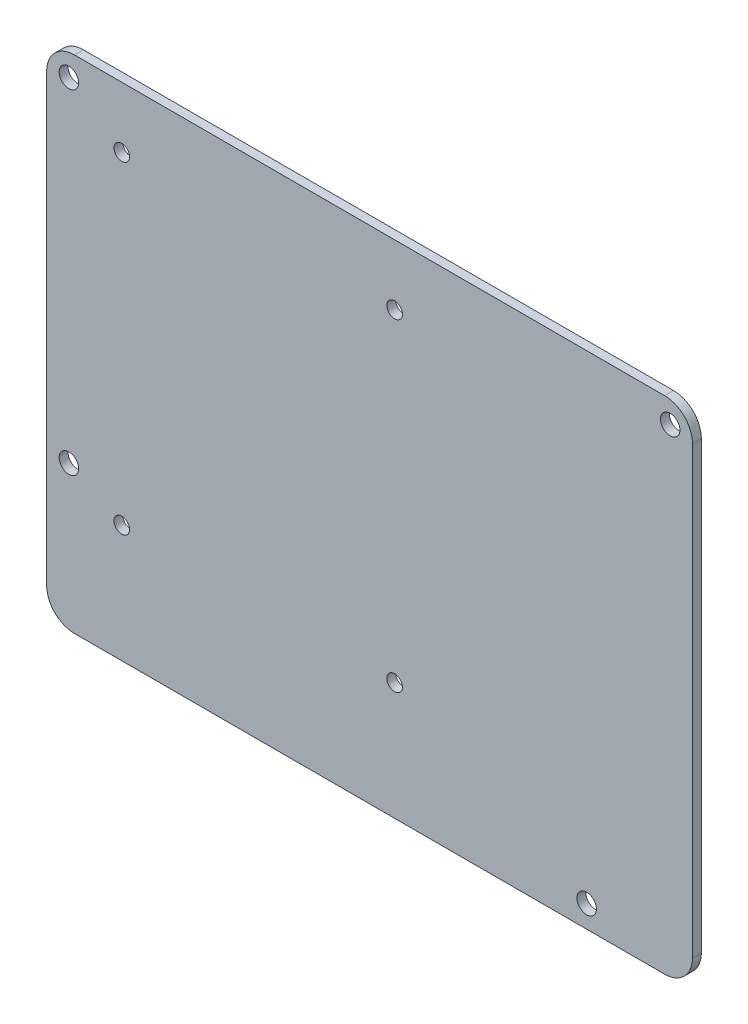
ISO-10303-21;
HEADER;
FILE_DESCRIPTION(('STEP AP214'),'2;1');
FILE_NAME('part.step','',(''),(''),'','','');
FILE_SCHEMA(('AUTOMOTIVE_DESIGN { 1 0 10303 214 1 1 1 1 }'));
ENDSEC;
DATA;
#1=APPLICATION_CONTEXT('core data for automotive mechanical design processes');
#2=APPLICATION_PROTOCOL_DEFINITION('international standard','automotive_design',2000,#1);
#3=PRODUCT_CONTEXT('',#1,'mechanical');
#4=PRODUCT('Part','Part','',(#3));
#5=PRODUCT_RELATED_PRODUCT_CATEGORY('part','',(#4));
#6=PRODUCT_DEFINITION_FORMATION('','',#4);
#7=PRODUCT_DEFINITION_CONTEXT('part definition',#1,'design');
#8=PRODUCT_DEFINITION('design','',#6,#7);
#9=PRODUCT_DEFINITION_SHAPE('','',#8);
#10=(LENGTH_UNIT() NAMED_UNIT(*) SI_UNIT(.MILLI.,.METRE.));
#11=(NAMED_UNIT(*) PLANE_ANGLE_UNIT() SI_UNIT($,.RADIAN.));
#12=(NAMED_UNIT(*) SI_UNIT($,.STERADIAN.) SOLID_ANGLE_UNIT());
#13=UNCERTAINTY_MEASURE_WITH_UNIT(LENGTH_MEASURE(1.E-05),#10,'distance_accuracy_value','');
#14=(GEOMETRIC_REPRESENTATION_CONTEXT(3) GLOBAL_UNCERTAINTY_ASSIGNED_CONTEXT((#13)) GLOBAL_UNIT_ASSIGNED_CONTEXT((#10,
#11,#12)) REPRESENTATION_CONTEXT('',''));
#15=CARTESIAN_POINT('',(0.,0.,0.));
#16=DIRECTION('',(0.,0.,1.));
#17=DIRECTION('',(1.,0.,0.));
#18=AXIS2_PLACEMENT_3D('',#15,#16,#17);
#19=CARTESIAN_POINT('',(-97.0000000000001,86.,1.6));
#20=DIRECTION('',(1.,0.,0.));
#21=DIRECTION('',(0.,1.,0.));
#22=AXIS2_PLACEMENT_3D('',#19,#20,#21);
#23=PLANE('',#22);
#24=DIRECTION('',(0.,-1.,0.));
#25=VECTOR('',#24,1.);
#26=CARTESIAN_POINT('',(-97.0000000000001,86.,1.6));
#27=LINE('',#26,#25);
#28=CARTESIAN_POINT('',(-97.0000000000001,81.,1.6));
#29=VERTEX_POINT('',#28);
#30=CARTESIAN_POINT('',(-97.0000000000001,1.00000000000003,1.6));
#31=VERTEX_POINT('',#30);
#32=EDGE_CURVE('E127',#29,#31,#27,.T.);
#33=ORIENTED_EDGE('',*,*,#32,.F.);
#34=DIRECTION('',(0.,0.,-1.));
#35=VECTOR('',#34,1.);
#36=CARTESIAN_POINT('',(-97.0000000000001,81.,1.6));
#37=LINE('',#36,#35);
#38=CARTESIAN_POINT('',(-97.0000000000001,81.,0.));
#39=VERTEX_POINT('',#38);
#40=EDGE_CURVE('E153',#29,#39,#37,.T.);
#41=ORIENTED_EDGE('',*,*,#40,.T.);
#42=DIRECTION('',(0.,-1.,0.));
#43=VECTOR('',#42,1.);
#44=CARTESIAN_POINT('',(-97.0000000000001,86.,0.));
#45=LINE('',#44,#43);
#46=CARTESIAN_POINT('',(-97.0000000000001,1.00000000000003,0.));
#47=VERTEX_POINT('',#46);
#48=EDGE_CURVE('E159',#39,#47,#45,.T.);
#49=ORIENTED_EDGE('',*,*,#48,.T.);
#50=DIRECTION('',(0.,0.,-1.));
#51=VECTOR('',#50,1.);
#52=CARTESIAN_POINT('',(-97.0000000000001,1.,1.6));
#53=LINE('',#52,#51);
#54=EDGE_CURVE('E151',#47,#31,#53,.F.);
#55=ORIENTED_EDGE('',*,*,#54,.T.);
#56=EDGE_LOOP('',(#33,#41,#49,#55));
#57=FACE_BOUND('',#56,.T.);
#58=ADVANCED_FACE('F35',(#57),#23,.F.);
#59=CARTESIAN_POINT('',(18.9999999999999,-3.99999999999999,1.6));
#60=DIRECTION('',(0.,1.,0.));
#61=DIRECTION('',(-1.,0.,0.));
#62=AXIS2_PLACEMENT_3D('',#59,#60,#61);
#63=PLANE('',#62);
#64=DIRECTION('',(1.,0.,0.));
#65=VECTOR('',#64,1.);
#66=CARTESIAN_POINT('',(18.9999999999999,-3.99999999999999,1.6));
#67=LINE('',#66,#65);
#68=CARTESIAN_POINT('',(-92.,-4.,1.6));
#69=VERTEX_POINT('',#68);
#70=CARTESIAN_POINT('',(13.9999999999999,-3.99999999999999,1.6));
#71=VERTEX_POINT('',#70);
#72=EDGE_CURVE('E130',#69,#71,#67,.T.);
#73=ORIENTED_EDGE('',*,*,#72,.F.);
#74=DIRECTION('',(0.,0.,-1.));
#75=VECTOR('',#74,1.);
#76=CARTESIAN_POINT('',(-92.0000000000001,-4.,1.6));
#77=LINE('',#76,#75);
#78=CARTESIAN_POINT('',(-92.,-4.,0.));
#79=VERTEX_POINT('',#78);
#80=EDGE_CURVE('E11',#69,#79,#77,.T.);
#81=ORIENTED_EDGE('',*,*,#80,.T.);
#82=DIRECTION('',(1.,0.,0.));
#83=VECTOR('',#82,1.);
#84=CARTESIAN_POINT('',(18.9999999999999,-3.99999999999999,0.));
#85=LINE('',#84,#83);
#86=CARTESIAN_POINT('',(13.9999999999999,-3.99999999999999,0.));
#87=VERTEX_POINT('',#86);
#88=EDGE_CURVE('E132',#79,#87,#85,.T.);
#89=ORIENTED_EDGE('',*,*,#88,.T.);
#90=DIRECTION('',(0.,0.,-1.));
#91=VECTOR('',#90,1.);
#92=CARTESIAN_POINT('',(13.9999999999999,-3.99999999999999,1.6));
#93=LINE('',#92,#91);
#94=EDGE_CURVE('E43',#87,#71,#93,.F.);
#95=ORIENTED_EDGE('',*,*,#94,.T.);
#96=EDGE_LOOP('',(#73,#81,#89,#95));
#97=FACE_BOUND('',#96,.T.);
#98=ADVANCED_FACE('F256',(#97),#63,.F.);
#99=CARTESIAN_POINT('',(18.9999999999999,86.,1.6));
#100=DIRECTION('',(-1.,0.,0.));
#101=DIRECTION('',(0.,-1.,0.));
#102=AXIS2_PLACEMENT_3D('',#99,#100,#101);
#103=PLANE('',#102);
#104=DIRECTION('',(0.,1.,0.));
#105=VECTOR('',#104,1.);
#106=CARTESIAN_POINT('',(18.9999999999999,86.,0.));
#107=LINE('',#106,#105);
#108=CARTESIAN_POINT('',(18.9999999999999,1.00000000000006,0.));
#109=VERTEX_POINT('',#108);
#110=CARTESIAN_POINT('',(18.9999999999999,81.,0.));
#111=VERTEX_POINT('',#110);
#112=EDGE_CURVE('E128',#109,#111,#107,.T.);
#113=ORIENTED_EDGE('',*,*,#112,.T.);
#114=DIRECTION('',(0.,0.,-1.));
#115=VECTOR('',#114,1.);
#116=CARTESIAN_POINT('',(18.9999999999999,81.,1.6));
#117=LINE('',#116,#115);
#118=CARTESIAN_POINT('',(18.9999999999999,81.,1.6));
#119=VERTEX_POINT('',#118);
#120=EDGE_CURVE('E106',#111,#119,#117,.F.);
#121=ORIENTED_EDGE('',*,*,#120,.T.);
#122=DIRECTION('',(0.,1.,0.));
#123=VECTOR('',#122,1.);
#124=CARTESIAN_POINT('',(18.9999999999999,86.,1.6));
#125=LINE('',#124,#123);
#126=CARTESIAN_POINT('',(18.9999999999999,1.00000000000006,1.6));
#127=VERTEX_POINT('',#126);
#128=EDGE_CURVE('E171',#127,#119,#125,.T.);
#129=ORIENTED_EDGE('',*,*,#128,.F.);
#130=DIRECTION('',(0.,0.,-1.));
#131=VECTOR('',#130,1.);
#132=CARTESIAN_POINT('',(18.9999999999999,1.00000000000003,1.6));
#133=LINE('',#132,#131);
#134=EDGE_CURVE('E111',#127,#109,#133,.T.);
#135=ORIENTED_EDGE('',*,*,#134,.T.);
#136=EDGE_LOOP('',(#113,#121,#129,#135));
#137=FACE_BOUND('',#136,.T.);
#138=ADVANCED_FACE('F254',(#137),#103,.F.);
#139=CARTESIAN_POINT('',(18.9999999999999,86.,1.6));
#140=DIRECTION('',(0.,-1.,0.));
#141=DIRECTION('',(1.,0.,0.));
#142=AXIS2_PLACEMENT_3D('',#139,#140,#141);
#143=PLANE('',#142);
#144=DIRECTION('',(-1.,0.,0.));
#145=VECTOR('',#144,1.);
#146=CARTESIAN_POINT('',(18.9999999999999,86.,1.6));
#147=LINE('',#146,#145);
#148=CARTESIAN_POINT('',(13.9999999999999,86.,1.6));
#149=VERTEX_POINT('',#148);
#150=CARTESIAN_POINT('',(-92.0000000000001,86.,1.6));
#151=VERTEX_POINT('',#150);
#152=EDGE_CURVE('E121',#149,#151,#147,.T.);
#153=ORIENTED_EDGE('',*,*,#152,.F.);
#154=DIRECTION('',(0.,0.,-1.));
#155=VECTOR('',#154,1.);
#156=CARTESIAN_POINT('',(13.9999999999999,86.,1.6));
#157=LINE('',#156,#155);
#158=CARTESIAN_POINT('',(13.9999999999999,86.,0.));
#159=VERTEX_POINT('',#158);
#160=EDGE_CURVE('E105',#149,#159,#157,.T.);
#161=ORIENTED_EDGE('',*,*,#160,.T.);
#162=DIRECTION('',(-1.,0.,0.));
#163=VECTOR('',#162,1.);
#164=CARTESIAN_POINT('',(18.9999999999999,86.,0.));
#165=LINE('',#164,#163);
#166=CARTESIAN_POINT('',(-92.0000000000001,86.,0.));
#167=VERTEX_POINT('',#166);
#168=EDGE_CURVE('E118',#159,#167,#165,.T.);
#169=ORIENTED_EDGE('',*,*,#168,.T.);
#170=DIRECTION('',(0.,0.,-1.));
#171=VECTOR('',#170,1.);
#172=CARTESIAN_POINT('',(-92.0000000000001,86.,1.6));
#173=LINE('',#172,#171);
#174=EDGE_CURVE('E123',#167,#151,#173,.F.);
#175=ORIENTED_EDGE('',*,*,#174,.T.);
#176=EDGE_LOOP('',(#153,#161,#169,#175));
#177=FACE_BOUND('',#176,.T.);
#178=ADVANCED_FACE('F117',(#177),#143,.F.);
#179=CARTESIAN_POINT('',(0.,0.,1.6));
#180=DIRECTION('',(0.,0.,-1.));
#181=DIRECTION('',(-1.,0.,0.));
#182=AXIS2_PLACEMENT_3D('',#179,#180,#181);
#183=PLANE('',#182);
#184=CARTESIAN_POINT('',(-34.5,75.1,1.6));
#185=DIRECTION('',(0.,0.,-1.));
#186=DIRECTION('',(-1.,0.,0.));
#187=AXIS2_PLACEMENT_3D('',#184,#185,#186);
#188=CIRCLE('',#187,1.4);
#189=CARTESIAN_POINT('',(-35.9,75.1,1.6));
#190=VERTEX_POINT('',#189);
#191=EDGE_CURVE('E213',#190,#190,#188,.T.);
#192=ORIENTED_EDGE('',*,*,#191,.T.);
#193=EDGE_LOOP('',(#192));
#194=FACE_BOUND('',#193,.T.);
#195=CARTESIAN_POINT('',(-83.5,75.1,1.6));
#196=DIRECTION('',(0.,0.,-1.));
#197=DIRECTION('',(-1.,0.,0.));
#198=AXIS2_PLACEMENT_3D('',#195,#196,#197);
#199=CIRCLE('',#198,1.4);
#200=CARTESIAN_POINT('',(-84.9,75.1,1.6));
#201=VERTEX_POINT('',#200);
#202=EDGE_CURVE('E207',#201,#201,#199,.T.);
#203=ORIENTED_EDGE('',*,*,#202,.T.);
#204=EDGE_LOOP('',(#203));
#205=FACE_BOUND('',#204,.T.);
#206=CARTESIAN_POINT('',(-83.5,17.1,1.6));
#207=DIRECTION('',(0.,0.,-1.));
#208=DIRECTION('',(-1.,0.,0.));
#209=AXIS2_PLACEMENT_3D('',#206,#207,#208);
#210=CIRCLE('',#209,1.4);
#211=CARTESIAN_POINT('',(-84.9,17.1,1.6));
#212=VERTEX_POINT('',#211);
#213=EDGE_CURVE('E201',#212,#212,#210,.T.);
#214=ORIENTED_EDGE('',*,*,#213,.T.);
#215=EDGE_LOOP('',(#214));
#216=FACE_BOUND('',#215,.T.);
#217=CARTESIAN_POINT('',(-34.5,17.1,1.6));
#218=DIRECTION('',(0.,0.,-1.));
#219=DIRECTION('',(-1.,0.,0.));
#220=AXIS2_PLACEMENT_3D('',#217,#218,#219);
#221=CIRCLE('',#220,1.4);
#222=CARTESIAN_POINT('',(-35.9,17.1,1.6));
#223=VERTEX_POINT('',#222);
#224=EDGE_CURVE('E195',#223,#223,#221,.T.);
#225=ORIENTED_EDGE('',*,*,#224,.T.);
#226=EDGE_LOOP('',(#225));
#227=FACE_BOUND('',#226,.T.);
#228=CARTESIAN_POINT('',(0.,0.,1.6));
#229=DIRECTION('',(0.,0.,1.));
#230=DIRECTION('',(1.,0.,0.));
#231=AXIS2_PLACEMENT_3D('',#228,#229,#230);
#232=CIRCLE('',#231,1.75);
#233=CARTESIAN_POINT('',(1.75,0.,1.6));
#234=VERTEX_POINT('',#233);
#235=EDGE_CURVE('E192',#234,#234,#232,.T.);
#236=ORIENTED_EDGE('',*,*,#235,.F.);
#237=EDGE_LOOP('',(#236));
#238=FACE_BOUND('',#237,.T.);
#239=CARTESIAN_POINT('',(15.,82.,1.6));
#240=DIRECTION('',(0.,0.,1.));
#241=DIRECTION('',(1.,0.,0.));
#242=AXIS2_PLACEMENT_3D('',#239,#240,#241);
#243=CIRCLE('',#242,1.74999999999999);
#244=CARTESIAN_POINT('',(16.75,82.,1.6));
#245=VERTEX_POINT('',#244);
#246=EDGE_CURVE('E186',#245,#245,#243,.T.);
#247=ORIENTED_EDGE('',*,*,#246,.F.);
#248=EDGE_LOOP('',(#247));
#249=FACE_BOUND('',#248,.T.);
#250=CARTESIAN_POINT('',(-93.,82.,1.6));
#251=DIRECTION('',(0.,0.,1.));
#252=DIRECTION('',(1.,0.,0.));
#253=AXIS2_PLACEMENT_3D('',#250,#251,#252);
#254=CIRCLE('',#253,1.75);
#255=CARTESIAN_POINT('',(-91.25,82.,1.6));
#256=VERTEX_POINT('',#255);
#257=EDGE_CURVE('E180',#256,#256,#254,.T.);
#258=ORIENTED_EDGE('',*,*,#257,.F.);
#259=EDGE_LOOP('',(#258));
#260=FACE_BOUND('',#259,.T.);
#261=CARTESIAN_POINT('',(-93.,22.,1.6));
#262=DIRECTION('',(0.,0.,1.));
#263=DIRECTION('',(1.,0.,0.));
#264=AXIS2_PLACEMENT_3D('',#261,#262,#263);
#265=CIRCLE('',#264,1.75);
#266=CARTESIAN_POINT('',(-91.25,22.,1.6));
#267=VERTEX_POINT('',#266);
#268=EDGE_CURVE('E167',#267,#267,#265,.T.);
#269=ORIENTED_EDGE('',*,*,#268,.F.);
#270=EDGE_LOOP('',(#269));
#271=FACE_BOUND('',#270,.T.);
#272=ORIENTED_EDGE('',*,*,#128,.T.);
#273=CARTESIAN_POINT('',(13.9999999999999,81.,1.6));
#274=DIRECTION('',(0.,0.,-1.));
#275=DIRECTION('',(-1.,0.,0.));
#276=AXIS2_PLACEMENT_3D('',#273,#274,#275);
#277=CIRCLE('',#276,5.);
#278=EDGE_CURVE('E149',#119,#149,#277,.F.);
#279=ORIENTED_EDGE('',*,*,#278,.T.);
#280=ORIENTED_EDGE('',*,*,#152,.T.);
#281=CARTESIAN_POINT('',(-92.0000000000001,81.,1.6));
#282=DIRECTION('',(0.,0.,-1.));
#283=DIRECTION('',(-1.,0.,0.));
#284=AXIS2_PLACEMENT_3D('',#281,#282,#283);
#285=CIRCLE('',#284,5.);
#286=EDGE_CURVE('E147',#151,#29,#285,.F.);
#287=ORIENTED_EDGE('',*,*,#286,.T.);
#288=ORIENTED_EDGE('',*,*,#32,.T.);
#289=CARTESIAN_POINT('',(-92.0000000000001,1.,1.6));
#290=DIRECTION('',(0.,0.,-1.));
#291=DIRECTION('',(-1.,0.,0.));
#292=AXIS2_PLACEMENT_3D('',#289,#290,#291);
#293=CIRCLE('',#292,5.);
#294=EDGE_CURVE('E56',#31,#69,#293,.F.);
#295=ORIENTED_EDGE('',*,*,#294,.T.);
#296=ORIENTED_EDGE('',*,*,#72,.T.);
#297=CARTESIAN_POINT('',(13.9999999999999,1.00000000000003,1.6));
#298=DIRECTION('',(0.,0.,-1.));
#299=DIRECTION('',(-1.,0.,0.));
#300=AXIS2_PLACEMENT_3D('',#297,#298,#299);
#301=CIRCLE('',#300,5.);
#302=EDGE_CURVE('E144',#71,#127,#301,.F.);
#303=ORIENTED_EDGE('',*,*,#302,.T.);
#304=EDGE_LOOP('',(#272,#279,#280,#287,#288,#295,#296,#303));
#305=FACE_BOUND('',#304,.T.);
#306=ADVANCED_FACE('F225',(#194,#205,#216,#227,#238,#249,#260,#271,#305),#183,.F.);
#307=CARTESIAN_POINT('',(0.,0.,0.));
#308=DIRECTION('',(0.,0.,-1.));
#309=DIRECTION('',(-1.,0.,0.));
#310=AXIS2_PLACEMENT_3D('',#307,#308,#309);
#311=PLANE('',#310);
#312=CARTESIAN_POINT('',(-34.5,75.1,0.));
#313=DIRECTION('',(0.,0.,-1.));
#314=DIRECTION('',(-1.,0.,0.));
#315=AXIS2_PLACEMENT_3D('',#312,#313,#314);
#316=CIRCLE('',#315,1.4);
#317=CARTESIAN_POINT('',(-35.9,75.1,0.));
#318=VERTEX_POINT('',#317);
#319=EDGE_CURVE('E216',#318,#318,#316,.T.);
#320=ORIENTED_EDGE('',*,*,#319,.F.);
#321=EDGE_LOOP('',(#320));
#322=FACE_BOUND('',#321,.T.);
#323=CARTESIAN_POINT('',(-83.5,75.1,0.));
#324=DIRECTION('',(0.,0.,-1.));
#325=DIRECTION('',(-1.,0.,0.));
#326=AXIS2_PLACEMENT_3D('',#323,#324,#325);
#327=CIRCLE('',#326,1.4);
#328=CARTESIAN_POINT('',(-84.9,75.1,0.));
#329=VERTEX_POINT('',#328);
#330=EDGE_CURVE('E210',#329,#329,#327,.T.);
#331=ORIENTED_EDGE('',*,*,#330,.F.);
#332=EDGE_LOOP('',(#331));
#333=FACE_BOUND('',#332,.T.);
#334=CARTESIAN_POINT('',(-83.5,17.1,0.));
#335=DIRECTION('',(0.,0.,-1.));
#336=DIRECTION('',(-1.,0.,0.));
#337=AXIS2_PLACEMENT_3D('',#334,#335,#336);
#338=CIRCLE('',#337,1.4);
#339=CARTESIAN_POINT('',(-84.9,17.1,0.));
#340=VERTEX_POINT('',#339);
#341=EDGE_CURVE('E204',#340,#340,#338,.T.);
#342=ORIENTED_EDGE('',*,*,#341,.F.);
#343=EDGE_LOOP('',(#342));
#344=FACE_BOUND('',#343,.T.);
#345=CARTESIAN_POINT('',(-34.5,17.1,0.));
#346=DIRECTION('',(0.,0.,-1.));
#347=DIRECTION('',(-1.,0.,0.));
#348=AXIS2_PLACEMENT_3D('',#345,#346,#347);
#349=CIRCLE('',#348,1.4);
#350=CARTESIAN_POINT('',(-35.9,17.1,0.));
#351=VERTEX_POINT('',#350);
#352=EDGE_CURVE('E198',#351,#351,#349,.T.);
#353=ORIENTED_EDGE('',*,*,#352,.F.);
#354=EDGE_LOOP('',(#353));
#355=FACE_BOUND('',#354,.T.);
#356=CARTESIAN_POINT('',(0.,0.,0.));
#357=DIRECTION('',(0.,0.,1.));
#358=DIRECTION('',(1.,0.,0.));
#359=AXIS2_PLACEMENT_3D('',#356,#357,#358);
#360=CIRCLE('',#359,1.75);
#361=CARTESIAN_POINT('',(1.75,0.,0.));
#362=VERTEX_POINT('',#361);
#363=EDGE_CURVE('E189',#362,#362,#360,.T.);
#364=ORIENTED_EDGE('',*,*,#363,.T.);
#365=EDGE_LOOP('',(#364));
#366=FACE_BOUND('',#365,.T.);
#367=CARTESIAN_POINT('',(15.,82.,0.));
#368=DIRECTION('',(0.,0.,1.));
#369=DIRECTION('',(1.,0.,0.));
#370=AXIS2_PLACEMENT_3D('',#367,#368,#369);
#371=CIRCLE('',#370,1.75);
#372=CARTESIAN_POINT('',(16.75,82.,0.));
#373=VERTEX_POINT('',#372);
#374=EDGE_CURVE('E183',#373,#373,#371,.T.);
#375=ORIENTED_EDGE('',*,*,#374,.T.);
#376=EDGE_LOOP('',(#375));
#377=FACE_BOUND('',#376,.T.);
#378=CARTESIAN_POINT('',(-93.,82.,0.));
#379=DIRECTION('',(0.,0.,1.));
#380=DIRECTION('',(1.,0.,0.));
#381=AXIS2_PLACEMENT_3D('',#378,#379,#380);
#382=CIRCLE('',#381,1.75);
#383=CARTESIAN_POINT('',(-91.25,82.,0.));
#384=VERTEX_POINT('',#383);
#385=EDGE_CURVE('E177',#384,#384,#382,.T.);
#386=ORIENTED_EDGE('',*,*,#385,.T.);
#387=EDGE_LOOP('',(#386));
#388=FACE_BOUND('',#387,.T.);
#389=CARTESIAN_POINT('',(-93.,22.,0.));
#390=DIRECTION('',(0.,0.,1.));
#391=DIRECTION('',(1.,0.,0.));
#392=AXIS2_PLACEMENT_3D('',#389,#390,#391);
#393=CIRCLE('',#392,1.75);
#394=CARTESIAN_POINT('',(-91.25,22.,0.));
#395=VERTEX_POINT('',#394);
#396=EDGE_CURVE('E164',#395,#395,#393,.T.);
#397=ORIENTED_EDGE('',*,*,#396,.T.);
#398=EDGE_LOOP('',(#397));
#399=FACE_BOUND('',#398,.T.);
#400=ORIENTED_EDGE('',*,*,#168,.F.);
#401=CARTESIAN_POINT('',(13.9999999999999,81.,0.));
#402=DIRECTION('',(0.,0.,-1.));
#403=DIRECTION('',(-1.,0.,0.));
#404=AXIS2_PLACEMENT_3D('',#401,#402,#403);
#405=CIRCLE('',#404,5.);
#406=EDGE_CURVE('E101',#159,#111,#405,.T.);
#407=ORIENTED_EDGE('',*,*,#406,.T.);
#408=ORIENTED_EDGE('',*,*,#112,.F.);
#409=CARTESIAN_POINT('',(13.9999999999999,1.00000000000003,0.));
#410=DIRECTION('',(0.,0.,-1.));
#411=DIRECTION('',(-1.,0.,0.));
#412=AXIS2_PLACEMENT_3D('',#409,#410,#411);
#413=CIRCLE('',#412,5.);
#414=EDGE_CURVE('E122',#109,#87,#413,.T.);
#415=ORIENTED_EDGE('',*,*,#414,.T.);
#416=ORIENTED_EDGE('',*,*,#88,.F.);
#417=CARTESIAN_POINT('',(-92.0000000000001,1.,0.));
#418=DIRECTION('',(0.,0.,-1.));
#419=DIRECTION('',(-1.,0.,0.));
#420=AXIS2_PLACEMENT_3D('',#417,#418,#419);
#421=CIRCLE('',#420,5.);
#422=EDGE_CURVE('E138',#79,#47,#421,.T.);
#423=ORIENTED_EDGE('',*,*,#422,.T.);
#424=ORIENTED_EDGE('',*,*,#48,.F.);
#425=CARTESIAN_POINT('',(-92.0000000000001,81.,0.));
#426=DIRECTION('',(0.,0.,-1.));
#427=DIRECTION('',(-1.,0.,0.));
#428=AXIS2_PLACEMENT_3D('',#425,#426,#427);
#429=CIRCLE('',#428,5.);
#430=EDGE_CURVE('E112',#39,#167,#429,.T.);
#431=ORIENTED_EDGE('',*,*,#430,.T.);
#432=EDGE_LOOP('',(#400,#407,#408,#415,#416,#423,#424,#431));
#433=FACE_BOUND('',#432,.T.);
#434=ADVANCED_FACE('F125',(#322,#333,#344,#355,#366,#377,#388,#399,#433),#311,.T.);
#435=CARTESIAN_POINT('',(-93.,22.,1.6));
#436=DIRECTION('',(0.,0.,1.));
#437=DIRECTION('',(1.,0.,0.));
#438=AXIS2_PLACEMENT_3D('',#435,#436,#437);
#439=CYLINDRICAL_SURFACE('',#438,1.75);
#440=ORIENTED_EDGE('',*,*,#396,.F.);
#441=EDGE_LOOP('',(#440));
#442=FACE_BOUND('',#441,.T.);
#443=ORIENTED_EDGE('',*,*,#268,.T.);
#444=EDGE_LOOP('',(#443));
#445=FACE_BOUND('',#444,.T.);
#446=ADVANCED_FACE('F224',(#442,#445),#439,.F.);
#447=CARTESIAN_POINT('',(-93.,82.,1.6));
#448=DIRECTION('',(0.,0.,1.));
#449=DIRECTION('',(1.,0.,0.));
#450=AXIS2_PLACEMENT_3D('',#447,#448,#449);
#451=CYLINDRICAL_SURFACE('',#450,1.75);
#452=ORIENTED_EDGE('',*,*,#385,.F.);
#453=EDGE_LOOP('',(#452));
#454=FACE_BOUND('',#453,.T.);
#455=ORIENTED_EDGE('',*,*,#257,.T.);
#456=EDGE_LOOP('',(#455));
#457=FACE_BOUND('',#456,.T.);
#458=ADVANCED_FACE('F243',(#454,#457),#451,.F.);
#459=CARTESIAN_POINT('',(15.,82.,1.6));
#460=DIRECTION('',(0.,0.,1.));
#461=DIRECTION('',(1.,0.,0.));
#462=AXIS2_PLACEMENT_3D('',#459,#460,#461);
#463=CYLINDRICAL_SURFACE('',#462,1.75);
#464=ORIENTED_EDGE('',*,*,#374,.F.);
#465=EDGE_LOOP('',(#464));
#466=FACE_BOUND('',#465,.T.);
#467=ORIENTED_EDGE('',*,*,#246,.T.);
#468=EDGE_LOOP('',(#467));
#469=FACE_BOUND('',#468,.T.);
#470=ADVANCED_FACE('F282',(#466,#469),#463,.F.);
#471=CARTESIAN_POINT('',(0.,0.,1.6));
#472=DIRECTION('',(0.,0.,1.));
#473=DIRECTION('',(1.,0.,0.));
#474=AXIS2_PLACEMENT_3D('',#471,#472,#473);
#475=CYLINDRICAL_SURFACE('',#474,1.75);
#476=ORIENTED_EDGE('',*,*,#363,.F.);
#477=EDGE_LOOP('',(#476));
#478=FACE_BOUND('',#477,.T.);
#479=ORIENTED_EDGE('',*,*,#235,.T.);
#480=EDGE_LOOP('',(#479));
#481=FACE_BOUND('',#480,.T.);
#482=ADVANCED_FACE('F267',(#478,#481),#475,.F.);
#483=CARTESIAN_POINT('',(13.9999999999999,81.,1.6));
#484=DIRECTION('',(0.,0.,-1.));
#485=DIRECTION('',(-1.,0.,0.));
#486=AXIS2_PLACEMENT_3D('',#483,#484,#485);
#487=CYLINDRICAL_SURFACE('',#486,5.);
#488=ORIENTED_EDGE('',*,*,#278,.F.);
#489=ORIENTED_EDGE('',*,*,#120,.F.);
#490=ORIENTED_EDGE('',*,*,#406,.F.);
#491=ORIENTED_EDGE('',*,*,#160,.F.);
#492=EDGE_LOOP('',(#488,#489,#490,#491));
#493=FACE_BOUND('',#492,.T.);
#494=ADVANCED_FACE('F104',(#493),#487,.T.);
#495=CARTESIAN_POINT('',(-92.0000000000001,81.,1.6));
#496=DIRECTION('',(0.,0.,-1.));
#497=DIRECTION('',(-1.,0.,0.));
#498=AXIS2_PLACEMENT_3D('',#495,#496,#497);
#499=CYLINDRICAL_SURFACE('',#498,5.);
#500=ORIENTED_EDGE('',*,*,#286,.F.);
#501=ORIENTED_EDGE('',*,*,#174,.F.);
#502=ORIENTED_EDGE('',*,*,#430,.F.);
#503=ORIENTED_EDGE('',*,*,#40,.F.);
#504=EDGE_LOOP('',(#500,#501,#502,#503));
#505=FACE_BOUND('',#504,.T.);
#506=ADVANCED_FACE('F260',(#505),#499,.T.);
#507=CARTESIAN_POINT('',(-92.0000000000001,1.,1.6));
#508=DIRECTION('',(0.,0.,-1.));
#509=DIRECTION('',(-1.,0.,0.));
#510=AXIS2_PLACEMENT_3D('',#507,#508,#509);
#511=CYLINDRICAL_SURFACE('',#510,5.);
#512=ORIENTED_EDGE('',*,*,#294,.F.);
#513=ORIENTED_EDGE('',*,*,#54,.F.);
#514=ORIENTED_EDGE('',*,*,#422,.F.);
#515=ORIENTED_EDGE('',*,*,#80,.F.);
#516=EDGE_LOOP('',(#512,#513,#514,#515));
#517=FACE_BOUND('',#516,.T.);
#518=ADVANCED_FACE('F259',(#517),#511,.T.);
#519=CARTESIAN_POINT('',(13.9999999999999,1.00000000000003,1.6));
#520=DIRECTION('',(0.,0.,-1.));
#521=DIRECTION('',(-1.,0.,0.));
#522=AXIS2_PLACEMENT_3D('',#519,#520,#521);
#523=CYLINDRICAL_SURFACE('',#522,5.);
#524=ORIENTED_EDGE('',*,*,#302,.F.);
#525=ORIENTED_EDGE('',*,*,#94,.F.);
#526=ORIENTED_EDGE('',*,*,#414,.F.);
#527=ORIENTED_EDGE('',*,*,#134,.F.);
#528=EDGE_LOOP('',(#524,#525,#526,#527));
#529=FACE_BOUND('',#528,.T.);
#530=ADVANCED_FACE('F37',(#529),#523,.T.);
#531=CARTESIAN_POINT('',(-34.5,17.1,0.));
#532=DIRECTION('',(0.,0.,-1.));
#533=DIRECTION('',(-1.,0.,0.));
#534=AXIS2_PLACEMENT_3D('',#531,#532,#533);
#535=CYLINDRICAL_SURFACE('',#534,1.4);
#536=ORIENTED_EDGE('',*,*,#224,.F.);
#537=EDGE_LOOP('',(#536));
#538=FACE_BOUND('',#537,.T.);
#539=ORIENTED_EDGE('',*,*,#352,.T.);
#540=EDGE_LOOP('',(#539));
#541=FACE_BOUND('',#540,.T.);
#542=ADVANCED_FACE('F290',(#538,#541),#535,.F.);
#543=CARTESIAN_POINT('',(-83.5,17.1,0.));
#544=DIRECTION('',(0.,0.,-1.));
#545=DIRECTION('',(-1.,0.,0.));
#546=AXIS2_PLACEMENT_3D('',#543,#544,#545);
#547=CYLINDRICAL_SURFACE('',#546,1.4);
#548=ORIENTED_EDGE('',*,*,#213,.F.);
#549=EDGE_LOOP('',(#548));
#550=FACE_BOUND('',#549,.T.);
#551=ORIENTED_EDGE('',*,*,#341,.T.);
#552=EDGE_LOOP('',(#551));
#553=FACE_BOUND('',#552,.T.);
#554=ADVANCED_FACE('F293',(#550,#553),#547,.F.);
#555=CARTESIAN_POINT('',(-83.5,75.1,0.));
#556=DIRECTION('',(0.,0.,-1.));
#557=DIRECTION('',(-1.,0.,0.));
#558=AXIS2_PLACEMENT_3D('',#555,#556,#557);
#559=CYLINDRICAL_SURFACE('',#558,1.4);
#560=ORIENTED_EDGE('',*,*,#202,.F.);
#561=EDGE_LOOP('',(#560));
#562=FACE_BOUND('',#561,.T.);
#563=ORIENTED_EDGE('',*,*,#330,.T.);
#564=EDGE_LOOP('',(#563));
#565=FACE_BOUND('',#564,.T.);
#566=ADVANCED_FACE('F297',(#562,#565),#559,.F.);
#567=CARTESIAN_POINT('',(-34.5,75.1,0.));
#568=DIRECTION('',(0.,0.,-1.));
#569=DIRECTION('',(-1.,0.,0.));
#570=AXIS2_PLACEMENT_3D('',#567,#568,#569);
#571=CYLINDRICAL_SURFACE('',#570,1.4);
#572=ORIENTED_EDGE('',*,*,#191,.F.);
#573=EDGE_LOOP('',(#572));
#574=FACE_BOUND('',#573,.T.);
#575=ORIENTED_EDGE('',*,*,#319,.T.);
#576=EDGE_LOOP('',(#575));
#577=FACE_BOUND('',#576,.T.);
#578=ADVANCED_FACE('F220',(#574,#577),#571,.F.);
#579=CLOSED_SHELL('',(#58,#98,#138,#178,#306,#434,#446,#458,#470,#482,#494,#506,#518,#530,#542,
#554,#566,#578));
#580=MANIFOLD_SOLID_BREP('B2',#579);
#581=ADVANCED_BREP_SHAPE_REPRESENTATION('',(#18,#580),#14);
#582=SHAPE_DEFINITION_REPRESENTATION(#9,#581);
ENDSEC;
END-ISO-10303-21;
